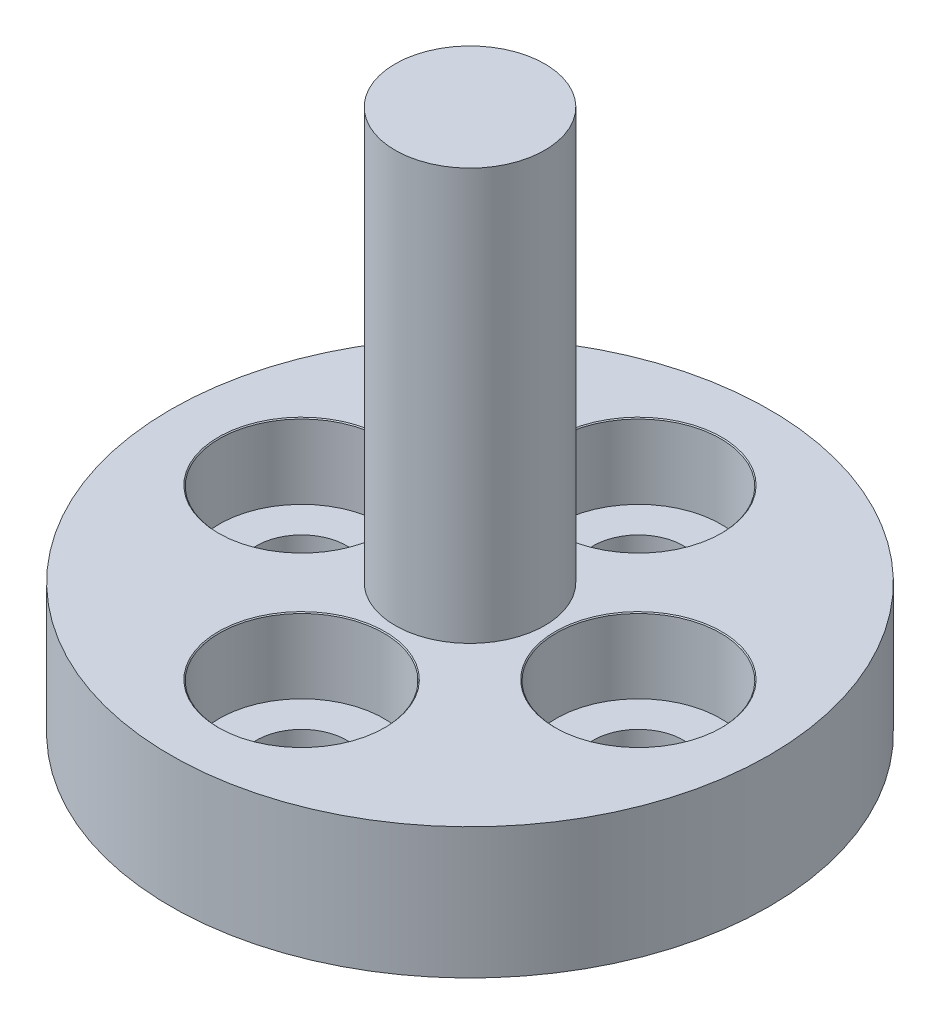
ISO-10303-21;
HEADER;
FILE_DESCRIPTION(('STEP AP214'),'2;1');
FILE_NAME('part.step','',(''),(''),'','','');
FILE_SCHEMA(('AUTOMOTIVE_DESIGN { 1 0 10303 214 1 1 1 1 }'));
ENDSEC;
DATA;
#1=APPLICATION_CONTEXT('core data for automotive mechanical design processes');
#2=APPLICATION_PROTOCOL_DEFINITION('international standard','automotive_design',2000,#1);
#3=PRODUCT_CONTEXT('',#1,'mechanical');
#4=PRODUCT('Part','Part','',(#3));
#5=PRODUCT_RELATED_PRODUCT_CATEGORY('part','',(#4));
#6=PRODUCT_DEFINITION_FORMATION('','',#4);
#7=PRODUCT_DEFINITION_CONTEXT('part definition',#1,'design');
#8=PRODUCT_DEFINITION('design','',#6,#7);
#9=PRODUCT_DEFINITION_SHAPE('','',#8);
#10=(LENGTH_UNIT() NAMED_UNIT(*) SI_UNIT(.MILLI.,.METRE.));
#11=(NAMED_UNIT(*) PLANE_ANGLE_UNIT() SI_UNIT($,.RADIAN.));
#12=(NAMED_UNIT(*) SI_UNIT($,.STERADIAN.) SOLID_ANGLE_UNIT());
#13=UNCERTAINTY_MEASURE_WITH_UNIT(LENGTH_MEASURE(1.E-05),#10,'distance_accuracy_value','');
#14=(GEOMETRIC_REPRESENTATION_CONTEXT(3) GLOBAL_UNCERTAINTY_ASSIGNED_CONTEXT((#13)) GLOBAL_UNIT_ASSIGNED_CONTEXT((#10,
#11,#12)) REPRESENTATION_CONTEXT('',''));
#15=CARTESIAN_POINT('',(0.,0.,0.));
#16=DIRECTION('',(0.,0.,1.));
#17=DIRECTION('',(1.,0.,0.));
#18=AXIS2_PLACEMENT_3D('',#15,#16,#17);
#19=CARTESIAN_POINT('',(0.,0.,0.));
#20=DIRECTION('',(0.,1.,0.));
#21=DIRECTION('',(-1.,0.,0.));
#22=AXIS2_PLACEMENT_3D('',#19,#20,#21);
#23=PLANE('',#22);
#24=CARTESIAN_POINT('',(-4.5,0.,0.));
#25=DIRECTION('',(0.,1.,0.));
#26=DIRECTION('',(0.,0.,1.));
#27=AXIS2_PLACEMENT_3D('',#24,#25,#26);
#28=CIRCLE('',#27,1.2);
#29=CARTESIAN_POINT('',(-4.5,0.,1.2));
#30=VERTEX_POINT('',#29);
#31=EDGE_CURVE('E103',#30,#30,#28,.T.);
#32=ORIENTED_EDGE('',*,*,#31,.T.);
#33=EDGE_LOOP('',(#32));
#34=FACE_BOUND('',#33,.T.);
#35=CARTESIAN_POINT('',(0.,0.,-4.5));
#36=DIRECTION('',(0.,1.,0.));
#37=DIRECTION('',(0.,0.,1.));
#38=AXIS2_PLACEMENT_3D('',#35,#36,#37);
#39=CIRCLE('',#38,1.2);
#40=CARTESIAN_POINT('',(0.,0.,-3.3));
#41=VERTEX_POINT('',#40);
#42=EDGE_CURVE('E88',#41,#41,#39,.T.);
#43=ORIENTED_EDGE('',*,*,#42,.T.);
#44=EDGE_LOOP('',(#43));
#45=FACE_BOUND('',#44,.T.);
#46=CARTESIAN_POINT('',(4.5,0.,0.));
#47=DIRECTION('',(0.,1.,0.));
#48=DIRECTION('',(0.,0.,1.));
#49=AXIS2_PLACEMENT_3D('',#46,#47,#48);
#50=CIRCLE('',#49,1.2);
#51=CARTESIAN_POINT('',(4.5,0.,1.2));
#52=VERTEX_POINT('',#51);
#53=EDGE_CURVE('E73',#52,#52,#50,.T.);
#54=ORIENTED_EDGE('',*,*,#53,.T.);
#55=EDGE_LOOP('',(#54));
#56=FACE_BOUND('',#55,.T.);
#57=CARTESIAN_POINT('',(0.,0.,4.5));
#58=DIRECTION('',(0.,1.,0.));
#59=DIRECTION('',(0.,0.,1.));
#60=AXIS2_PLACEMENT_3D('',#57,#58,#59);
#61=CIRCLE('',#60,1.2);
#62=CARTESIAN_POINT('',(0.,0.,5.7));
#63=VERTEX_POINT('',#62);
#64=EDGE_CURVE('E58',#63,#63,#61,.T.);
#65=ORIENTED_EDGE('',*,*,#64,.T.);
#66=EDGE_LOOP('',(#65));
#67=FACE_BOUND('',#66,.T.);
#68=CARTESIAN_POINT('',(0.,0.,0.));
#69=DIRECTION('',(0.,1.,0.));
#70=DIRECTION('',(-1.,0.,0.));
#71=AXIS2_PLACEMENT_3D('',#68,#69,#70);
#72=CIRCLE('',#71,8.);
#73=CARTESIAN_POINT('',(-8.,0.,0.));
#74=VERTEX_POINT('',#73);
#75=EDGE_CURVE('E10',#74,#74,#72,.T.);
#76=ORIENTED_EDGE('',*,*,#75,.F.);
#77=EDGE_LOOP('',(#76));
#78=FACE_BOUND('',#77,.T.);
#79=ADVANCED_FACE('F39',(#34,#45,#56,#67,#78),#23,.F.);
#80=CARTESIAN_POINT('',(0.,14.5,0.));
#81=DIRECTION('',(0.,1.,0.));
#82=DIRECTION('',(-1.,0.,0.));
#83=AXIS2_PLACEMENT_3D('',#80,#81,#82);
#84=CYLINDRICAL_SURFACE('',#83,8.);
#85=CARTESIAN_POINT('',(0.,3.5,0.));
#86=DIRECTION('',(0.,1.,0.));
#87=DIRECTION('',(-1.,0.,0.));
#88=AXIS2_PLACEMENT_3D('',#85,#86,#87);
#89=CIRCLE('',#88,8.);
#90=CARTESIAN_POINT('',(-8.,3.5,0.));
#91=VERTEX_POINT('',#90);
#92=EDGE_CURVE('E45',#91,#91,#89,.T.);
#93=ORIENTED_EDGE('',*,*,#92,.F.);
#94=EDGE_LOOP('',(#93));
#95=FACE_BOUND('',#94,.T.);
#96=ORIENTED_EDGE('',*,*,#75,.T.);
#97=EDGE_LOOP('',(#96));
#98=FACE_BOUND('',#97,.T.);
#99=ADVANCED_FACE('F125',(#95,#98),#84,.T.);
#100=CARTESIAN_POINT('',(8.,3.5,0.));
#101=DIRECTION('',(0.,-1.,0.));
#102=DIRECTION('',(1.,0.,0.));
#103=AXIS2_PLACEMENT_3D('',#100,#101,#102);
#104=PLANE('',#103);
#105=CARTESIAN_POINT('',(-4.5,3.5,0.));
#106=DIRECTION('',(0.,1.,0.));
#107=DIRECTION('',(0.,0.,1.));
#108=AXIS2_PLACEMENT_3D('',#105,#106,#107);
#109=CIRCLE('',#108,2.225);
#110=CARTESIAN_POINT('',(-4.5,3.5,2.225));
#111=VERTEX_POINT('',#110);
#112=EDGE_CURVE('E115',#111,#111,#109,.T.);
#113=ORIENTED_EDGE('',*,*,#112,.F.);
#114=EDGE_LOOP('',(#113));
#115=FACE_BOUND('',#114,.T.);
#116=CARTESIAN_POINT('',(0.,3.5,-4.5));
#117=DIRECTION('',(0.,1.,0.));
#118=DIRECTION('',(0.,0.,1.));
#119=AXIS2_PLACEMENT_3D('',#116,#117,#118);
#120=CIRCLE('',#119,2.225);
#121=CARTESIAN_POINT('',(0.,3.5,-2.275));
#122=VERTEX_POINT('',#121);
#123=EDGE_CURVE('E100',#122,#122,#120,.T.);
#124=ORIENTED_EDGE('',*,*,#123,.F.);
#125=EDGE_LOOP('',(#124));
#126=FACE_BOUND('',#125,.T.);
#127=CARTESIAN_POINT('',(4.5,3.5,0.));
#128=DIRECTION('',(0.,1.,0.));
#129=DIRECTION('',(0.,0.,1.));
#130=AXIS2_PLACEMENT_3D('',#127,#128,#129);
#131=CIRCLE('',#130,2.225);
#132=CARTESIAN_POINT('',(4.5,3.5,2.225));
#133=VERTEX_POINT('',#132);
#134=EDGE_CURVE('E85',#133,#133,#131,.T.);
#135=ORIENTED_EDGE('',*,*,#134,.F.);
#136=EDGE_LOOP('',(#135));
#137=FACE_BOUND('',#136,.T.);
#138=CARTESIAN_POINT('',(0.,3.5,4.5));
#139=DIRECTION('',(0.,1.,0.));
#140=DIRECTION('',(0.,0.,1.));
#141=AXIS2_PLACEMENT_3D('',#138,#139,#140);
#142=CIRCLE('',#141,2.225);
#143=CARTESIAN_POINT('',(0.,3.5,6.725));
#144=VERTEX_POINT('',#143);
#145=EDGE_CURVE('E70',#144,#144,#142,.T.);
#146=ORIENTED_EDGE('',*,*,#145,.F.);
#147=EDGE_LOOP('',(#146));
#148=FACE_BOUND('',#147,.T.);
#149=CARTESIAN_POINT('',(0.,3.5,0.));
#150=DIRECTION('',(0.,1.,0.));
#151=DIRECTION('',(-1.,0.,0.));
#152=AXIS2_PLACEMENT_3D('',#149,#150,#151);
#153=CIRCLE('',#152,2.);
#154=CARTESIAN_POINT('',(-2.,3.5,0.));
#155=VERTEX_POINT('',#154);
#156=EDGE_CURVE('E49',#155,#155,#153,.T.);
#157=ORIENTED_EDGE('',*,*,#156,.F.);
#158=EDGE_LOOP('',(#157));
#159=FACE_BOUND('',#158,.T.);
#160=ORIENTED_EDGE('',*,*,#92,.T.);
#161=EDGE_LOOP('',(#160));
#162=FACE_BOUND('',#161,.T.);
#163=ADVANCED_FACE('F121',(#115,#126,#137,#148,#159,#162),#104,.F.);
#164=CARTESIAN_POINT('',(0.,14.5,0.));
#165=DIRECTION('',(0.,1.,0.));
#166=DIRECTION('',(-1.,0.,0.));
#167=AXIS2_PLACEMENT_3D('',#164,#165,#166);
#168=CYLINDRICAL_SURFACE('',#167,2.);
#169=CARTESIAN_POINT('',(0.,14.5,0.));
#170=DIRECTION('',(0.,1.,0.));
#171=DIRECTION('',(-1.,0.,0.));
#172=AXIS2_PLACEMENT_3D('',#169,#170,#171);
#173=CIRCLE('',#172,2.);
#174=CARTESIAN_POINT('',(-2.,14.5,0.));
#175=VERTEX_POINT('',#174);
#176=EDGE_CURVE('E53',#175,#175,#173,.T.);
#177=ORIENTED_EDGE('',*,*,#176,.F.);
#178=EDGE_LOOP('',(#177));
#179=FACE_BOUND('',#178,.T.);
#180=ORIENTED_EDGE('',*,*,#156,.T.);
#181=EDGE_LOOP('',(#180));
#182=FACE_BOUND('',#181,.T.);
#183=ADVANCED_FACE('F124',(#179,#182),#168,.T.);
#184=CARTESIAN_POINT('',(2.,14.5,0.));
#185=DIRECTION('',(0.,-1.,0.));
#186=DIRECTION('',(1.,0.,0.));
#187=AXIS2_PLACEMENT_3D('',#184,#185,#186);
#188=PLANE('',#187);
#189=ORIENTED_EDGE('',*,*,#176,.T.);
#190=EDGE_LOOP('',(#189));
#191=FACE_BOUND('',#190,.T.);
#192=ADVANCED_FACE('F136',(#191),#188,.F.);
#193=CARTESIAN_POINT('',(0.,3.5,4.5));
#194=DIRECTION('',(0.,1.,0.));
#195=DIRECTION('',(0.,0.,1.));
#196=AXIS2_PLACEMENT_3D('',#193,#194,#195);
#197=CYLINDRICAL_SURFACE('',#196,1.2);
#198=ORIENTED_EDGE('',*,*,#64,.F.);
#199=EDGE_LOOP('',(#198));
#200=FACE_BOUND('',#199,.T.);
#201=CARTESIAN_POINT('',(0.,1.5,4.5));
#202=DIRECTION('',(0.,1.,0.));
#203=DIRECTION('',(0.,0.,1.));
#204=AXIS2_PLACEMENT_3D('',#201,#202,#203);
#205=CIRCLE('',#204,1.2);
#206=CARTESIAN_POINT('',(0.,1.5,5.7));
#207=VERTEX_POINT('',#206);
#208=EDGE_CURVE('E61',#207,#207,#205,.T.);
#209=ORIENTED_EDGE('',*,*,#208,.T.);
#210=EDGE_LOOP('',(#209));
#211=FACE_BOUND('',#210,.T.);
#212=ADVANCED_FACE('F143',(#200,#211),#197,.F.);
#213=CARTESIAN_POINT('',(2.2,1.5,4.5));
#214=DIRECTION('',(0.,-1.,0.));
#215=DIRECTION('',(0.,0.,-1.));
#216=AXIS2_PLACEMENT_3D('',#213,#214,#215);
#217=PLANE('',#216);
#218=ORIENTED_EDGE('',*,*,#208,.F.);
#219=EDGE_LOOP('',(#218));
#220=FACE_BOUND('',#219,.T.);
#221=CARTESIAN_POINT('',(0.,1.5,4.5));
#222=DIRECTION('',(0.,1.,0.));
#223=DIRECTION('',(0.,0.,1.));
#224=AXIS2_PLACEMENT_3D('',#221,#222,#223);
#225=CIRCLE('',#224,2.2);
#226=CARTESIAN_POINT('',(0.,1.5,6.7));
#227=VERTEX_POINT('',#226);
#228=EDGE_CURVE('E64',#227,#227,#225,.T.);
#229=ORIENTED_EDGE('',*,*,#228,.T.);
#230=EDGE_LOOP('',(#229));
#231=FACE_BOUND('',#230,.T.);
#232=ADVANCED_FACE('F163',(#220,#231),#217,.F.);
#233=CARTESIAN_POINT('',(0.,3.5,4.5));
#234=DIRECTION('',(0.,1.,0.));
#235=DIRECTION('',(0.,0.,1.));
#236=AXIS2_PLACEMENT_3D('',#233,#234,#235);
#237=CYLINDRICAL_SURFACE('',#236,2.2);
#238=ORIENTED_EDGE('',*,*,#228,.F.);
#239=EDGE_LOOP('',(#238));
#240=FACE_BOUND('',#239,.T.);
#241=CARTESIAN_POINT('',(0.,3.475,4.5));
#242=DIRECTION('',(0.,1.,0.));
#243=DIRECTION('',(0.,0.,1.));
#244=AXIS2_PLACEMENT_3D('',#241,#242,#243);
#245=CIRCLE('',#244,2.2);
#246=CARTESIAN_POINT('',(0.,3.475,6.7));
#247=VERTEX_POINT('',#246);
#248=EDGE_CURVE('E67',#247,#247,#245,.T.);
#249=ORIENTED_EDGE('',*,*,#248,.T.);
#250=EDGE_LOOP('',(#249));
#251=FACE_BOUND('',#250,.T.);
#252=ADVANCED_FACE('F169',(#240,#251),#237,.F.);
#253=CARTESIAN_POINT('',(0.,3.5,4.5));
#254=DIRECTION('',(0.,1.,0.));
#255=DIRECTION('',(0.,0.,1.));
#256=AXIS2_PLACEMENT_3D('',#253,#254,#255);
#257=CONICAL_SURFACE('',#256,2.225,0.785398163397457);
#258=ORIENTED_EDGE('',*,*,#248,.F.);
#259=EDGE_LOOP('',(#258));
#260=FACE_BOUND('',#259,.T.);
#261=ORIENTED_EDGE('',*,*,#145,.T.);
#262=EDGE_LOOP('',(#261));
#263=FACE_BOUND('',#262,.T.);
#264=ADVANCED_FACE('F175',(#260,#263),#257,.F.);
#265=CARTESIAN_POINT('',(4.5,3.5,0.));
#266=DIRECTION('',(0.,1.,0.));
#267=DIRECTION('',(0.,0.,1.));
#268=AXIS2_PLACEMENT_3D('',#265,#266,#267);
#269=CYLINDRICAL_SURFACE('',#268,1.2);
#270=ORIENTED_EDGE('',*,*,#53,.F.);
#271=EDGE_LOOP('',(#270));
#272=FACE_BOUND('',#271,.T.);
#273=CARTESIAN_POINT('',(4.5,1.5,0.));
#274=DIRECTION('',(0.,1.,0.));
#275=DIRECTION('',(0.,0.,1.));
#276=AXIS2_PLACEMENT_3D('',#273,#274,#275);
#277=CIRCLE('',#276,1.2);
#278=CARTESIAN_POINT('',(4.5,1.5,1.2));
#279=VERTEX_POINT('',#278);
#280=EDGE_CURVE('E76',#279,#279,#277,.T.);
#281=ORIENTED_EDGE('',*,*,#280,.T.);
#282=EDGE_LOOP('',(#281));
#283=FACE_BOUND('',#282,.T.);
#284=ADVANCED_FACE('F181',(#272,#283),#269,.F.);
#285=CARTESIAN_POINT('',(6.7,1.5,0.));
#286=DIRECTION('',(0.,-1.,0.));
#287=DIRECTION('',(0.,0.,-1.));
#288=AXIS2_PLACEMENT_3D('',#285,#286,#287);
#289=PLANE('',#288);
#290=ORIENTED_EDGE('',*,*,#280,.F.);
#291=EDGE_LOOP('',(#290));
#292=FACE_BOUND('',#291,.T.);
#293=CARTESIAN_POINT('',(4.5,1.5,0.));
#294=DIRECTION('',(0.,1.,0.));
#295=DIRECTION('',(0.,0.,1.));
#296=AXIS2_PLACEMENT_3D('',#293,#294,#295);
#297=CIRCLE('',#296,2.2);
#298=CARTESIAN_POINT('',(4.5,1.5,2.2));
#299=VERTEX_POINT('',#298);
#300=EDGE_CURVE('E79',#299,#299,#297,.T.);
#301=ORIENTED_EDGE('',*,*,#300,.T.);
#302=EDGE_LOOP('',(#301));
#303=FACE_BOUND('',#302,.T.);
#304=ADVANCED_FACE('F186',(#292,#303),#289,.F.);
#305=CARTESIAN_POINT('',(4.5,3.5,0.));
#306=DIRECTION('',(0.,1.,0.));
#307=DIRECTION('',(0.,0.,1.));
#308=AXIS2_PLACEMENT_3D('',#305,#306,#307);
#309=CYLINDRICAL_SURFACE('',#308,2.2);
#310=ORIENTED_EDGE('',*,*,#300,.F.);
#311=EDGE_LOOP('',(#310));
#312=FACE_BOUND('',#311,.T.);
#313=CARTESIAN_POINT('',(4.5,3.475,0.));
#314=DIRECTION('',(0.,1.,0.));
#315=DIRECTION('',(0.,0.,1.));
#316=AXIS2_PLACEMENT_3D('',#313,#314,#315);
#317=CIRCLE('',#316,2.2);
#318=CARTESIAN_POINT('',(4.5,3.475,2.2));
#319=VERTEX_POINT('',#318);
#320=EDGE_CURVE('E82',#319,#319,#317,.T.);
#321=ORIENTED_EDGE('',*,*,#320,.T.);
#322=EDGE_LOOP('',(#321));
#323=FACE_BOUND('',#322,.T.);
#324=ADVANCED_FACE('F192',(#312,#323),#309,.F.);
#325=CARTESIAN_POINT('',(4.5,3.5,0.));
#326=DIRECTION('',(0.,1.,0.));
#327=DIRECTION('',(0.,0.,1.));
#328=AXIS2_PLACEMENT_3D('',#325,#326,#327);
#329=CONICAL_SURFACE('',#328,2.225,0.785398163397466);
#330=ORIENTED_EDGE('',*,*,#320,.F.);
#331=EDGE_LOOP('',(#330));
#332=FACE_BOUND('',#331,.T.);
#333=ORIENTED_EDGE('',*,*,#134,.T.);
#334=EDGE_LOOP('',(#333));
#335=FACE_BOUND('',#334,.T.);
#336=ADVANCED_FACE('F196',(#332,#335),#329,.F.);
#337=CARTESIAN_POINT('',(0.,3.5,-4.5));
#338=DIRECTION('',(0.,1.,0.));
#339=DIRECTION('',(0.,0.,1.));
#340=AXIS2_PLACEMENT_3D('',#337,#338,#339);
#341=CYLINDRICAL_SURFACE('',#340,1.2);
#342=ORIENTED_EDGE('',*,*,#42,.F.);
#343=EDGE_LOOP('',(#342));
#344=FACE_BOUND('',#343,.T.);
#345=CARTESIAN_POINT('',(0.,1.5,-4.5));
#346=DIRECTION('',(0.,1.,0.));
#347=DIRECTION('',(0.,0.,1.));
#348=AXIS2_PLACEMENT_3D('',#345,#346,#347);
#349=CIRCLE('',#348,1.2);
#350=CARTESIAN_POINT('',(0.,1.5,-3.3));
#351=VERTEX_POINT('',#350);
#352=EDGE_CURVE('E91',#351,#351,#349,.T.);
#353=ORIENTED_EDGE('',*,*,#352,.T.);
#354=EDGE_LOOP('',(#353));
#355=FACE_BOUND('',#354,.T.);
#356=ADVANCED_FACE('F200',(#344,#355),#341,.F.);
#357=CARTESIAN_POINT('',(2.2,1.5,-4.5));
#358=DIRECTION('',(0.,-1.,0.));
#359=DIRECTION('',(0.,0.,-1.));
#360=AXIS2_PLACEMENT_3D('',#357,#358,#359);
#361=PLANE('',#360);
#362=ORIENTED_EDGE('',*,*,#352,.F.);
#363=EDGE_LOOP('',(#362));
#364=FACE_BOUND('',#363,.T.);
#365=CARTESIAN_POINT('',(0.,1.5,-4.5));
#366=DIRECTION('',(0.,1.,0.));
#367=DIRECTION('',(0.,0.,1.));
#368=AXIS2_PLACEMENT_3D('',#365,#366,#367);
#369=CIRCLE('',#368,2.2);
#370=CARTESIAN_POINT('',(0.,1.5,-2.3));
#371=VERTEX_POINT('',#370);
#372=EDGE_CURVE('E94',#371,#371,#369,.T.);
#373=ORIENTED_EDGE('',*,*,#372,.T.);
#374=EDGE_LOOP('',(#373));
#375=FACE_BOUND('',#374,.T.);
#376=ADVANCED_FACE('F204',(#364,#375),#361,.F.);
#377=CARTESIAN_POINT('',(0.,3.5,-4.5));
#378=DIRECTION('',(0.,1.,0.));
#379=DIRECTION('',(0.,0.,1.));
#380=AXIS2_PLACEMENT_3D('',#377,#378,#379);
#381=CYLINDRICAL_SURFACE('',#380,2.2);
#382=ORIENTED_EDGE('',*,*,#372,.F.);
#383=EDGE_LOOP('',(#382));
#384=FACE_BOUND('',#383,.T.);
#385=CARTESIAN_POINT('',(0.,3.475,-4.5));
#386=DIRECTION('',(0.,1.,0.));
#387=DIRECTION('',(0.,0.,1.));
#388=AXIS2_PLACEMENT_3D('',#385,#386,#387);
#389=CIRCLE('',#388,2.2);
#390=CARTESIAN_POINT('',(0.,3.475,-2.3));
#391=VERTEX_POINT('',#390);
#392=EDGE_CURVE('E97',#391,#391,#389,.T.);
#393=ORIENTED_EDGE('',*,*,#392,.T.);
#394=EDGE_LOOP('',(#393));
#395=FACE_BOUND('',#394,.T.);
#396=ADVANCED_FACE('F208',(#384,#395),#381,.F.);
#397=CARTESIAN_POINT('',(0.,3.5,-4.5));
#398=DIRECTION('',(0.,1.,0.));
#399=DIRECTION('',(0.,0.,1.));
#400=AXIS2_PLACEMENT_3D('',#397,#398,#399);
#401=CONICAL_SURFACE('',#400,2.225,0.785398163397457);
#402=ORIENTED_EDGE('',*,*,#392,.F.);
#403=EDGE_LOOP('',(#402));
#404=FACE_BOUND('',#403,.T.);
#405=ORIENTED_EDGE('',*,*,#123,.T.);
#406=EDGE_LOOP('',(#405));
#407=FACE_BOUND('',#406,.T.);
#408=ADVANCED_FACE('F212',(#404,#407),#401,.F.);
#409=CARTESIAN_POINT('',(-4.5,3.5,0.));
#410=DIRECTION('',(0.,1.,0.));
#411=DIRECTION('',(0.,0.,1.));
#412=AXIS2_PLACEMENT_3D('',#409,#410,#411);
#413=CYLINDRICAL_SURFACE('',#412,1.2);
#414=ORIENTED_EDGE('',*,*,#31,.F.);
#415=EDGE_LOOP('',(#414));
#416=FACE_BOUND('',#415,.T.);
#417=CARTESIAN_POINT('',(-4.5,1.5,0.));
#418=DIRECTION('',(0.,1.,0.));
#419=DIRECTION('',(0.,0.,1.));
#420=AXIS2_PLACEMENT_3D('',#417,#418,#419);
#421=CIRCLE('',#420,1.2);
#422=CARTESIAN_POINT('',(-4.5,1.5,1.2));
#423=VERTEX_POINT('',#422);
#424=EDGE_CURVE('E106',#423,#423,#421,.T.);
#425=ORIENTED_EDGE('',*,*,#424,.T.);
#426=EDGE_LOOP('',(#425));
#427=FACE_BOUND('',#426,.T.);
#428=ADVANCED_FACE('F216',(#416,#427),#413,.F.);
#429=CARTESIAN_POINT('',(-2.3,1.5,0.));
#430=DIRECTION('',(0.,-1.,0.));
#431=DIRECTION('',(0.,0.,-1.));
#432=AXIS2_PLACEMENT_3D('',#429,#430,#431);
#433=PLANE('',#432);
#434=ORIENTED_EDGE('',*,*,#424,.F.);
#435=EDGE_LOOP('',(#434));
#436=FACE_BOUND('',#435,.T.);
#437=CARTESIAN_POINT('',(-4.5,1.5,0.));
#438=DIRECTION('',(0.,1.,0.));
#439=DIRECTION('',(0.,0.,1.));
#440=AXIS2_PLACEMENT_3D('',#437,#438,#439);
#441=CIRCLE('',#440,2.2);
#442=CARTESIAN_POINT('',(-4.5,1.5,2.2));
#443=VERTEX_POINT('',#442);
#444=EDGE_CURVE('E109',#443,#443,#441,.T.);
#445=ORIENTED_EDGE('',*,*,#444,.T.);
#446=EDGE_LOOP('',(#445));
#447=FACE_BOUND('',#446,.T.);
#448=ADVANCED_FACE('F220',(#436,#447),#433,.F.);
#449=CARTESIAN_POINT('',(-4.5,3.5,0.));
#450=DIRECTION('',(0.,1.,0.));
#451=DIRECTION('',(0.,0.,1.));
#452=AXIS2_PLACEMENT_3D('',#449,#450,#451);
#453=CYLINDRICAL_SURFACE('',#452,2.2);
#454=ORIENTED_EDGE('',*,*,#444,.F.);
#455=EDGE_LOOP('',(#454));
#456=FACE_BOUND('',#455,.T.);
#457=CARTESIAN_POINT('',(-4.5,3.475,0.));
#458=DIRECTION('',(0.,1.,0.));
#459=DIRECTION('',(0.,0.,1.));
#460=AXIS2_PLACEMENT_3D('',#457,#458,#459);
#461=CIRCLE('',#460,2.2);
#462=CARTESIAN_POINT('',(-4.5,3.475,2.2));
#463=VERTEX_POINT('',#462);
#464=EDGE_CURVE('E112',#463,#463,#461,.T.);
#465=ORIENTED_EDGE('',*,*,#464,.T.);
#466=EDGE_LOOP('',(#465));
#467=FACE_BOUND('',#466,.T.);
#468=ADVANCED_FACE('F224',(#456,#467),#453,.F.);
#469=CARTESIAN_POINT('',(-4.5,3.5,0.));
#470=DIRECTION('',(0.,1.,0.));
#471=DIRECTION('',(0.,0.,1.));
#472=AXIS2_PLACEMENT_3D('',#469,#470,#471);
#473=CONICAL_SURFACE('',#472,2.225,0.785398163397457);
#474=ORIENTED_EDGE('',*,*,#464,.F.);
#475=EDGE_LOOP('',(#474));
#476=FACE_BOUND('',#475,.T.);
#477=ORIENTED_EDGE('',*,*,#112,.T.);
#478=EDGE_LOOP('',(#477));
#479=FACE_BOUND('',#478,.T.);
#480=ADVANCED_FACE('F119',(#476,#479),#473,.F.);
#481=CLOSED_SHELL('',(#79,#99,#163,#183,#192,#212,#232,#252,#264,#284,#304,#324,#336,#356,#376,
#396,#408,#428,#448,#468,#480));
#482=MANIFOLD_SOLID_BREP('B2',#481);
#483=ADVANCED_BREP_SHAPE_REPRESENTATION('',(#18,#482),#14);
#484=SHAPE_DEFINITION_REPRESENTATION(#9,#483);
ENDSEC;
END-ISO-10303-21;
